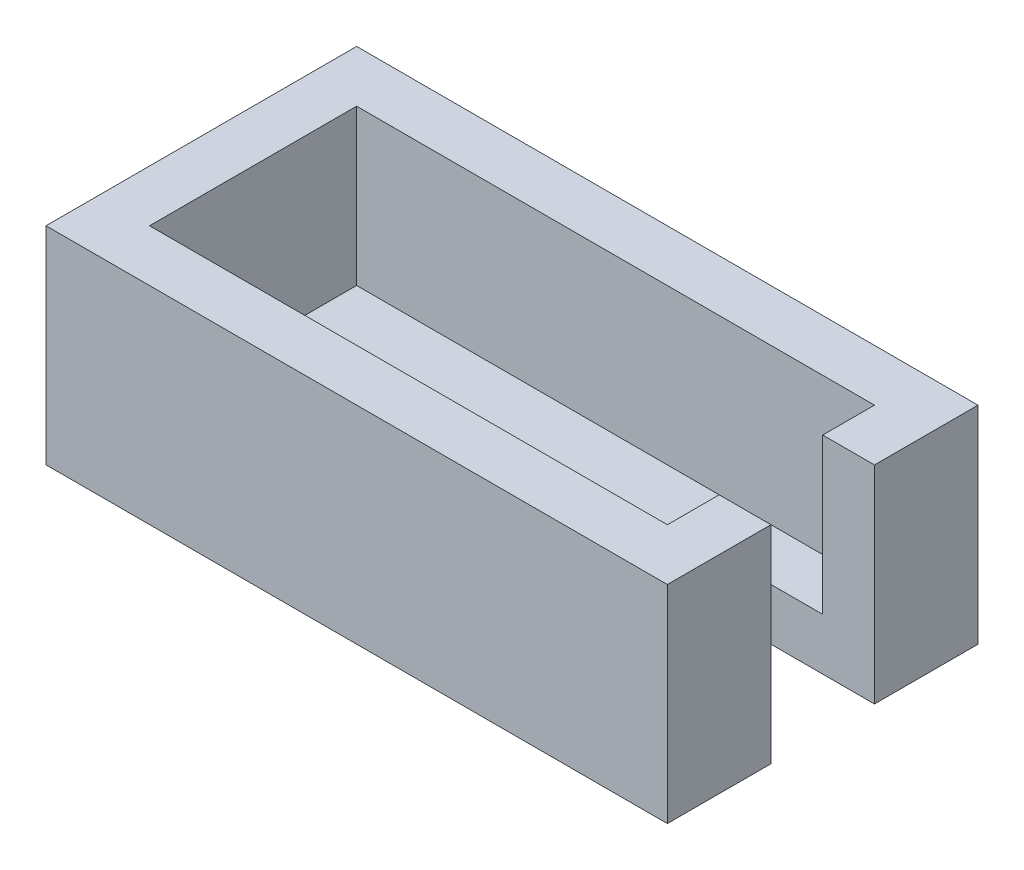
ISO-10303-21;
HEADER;
FILE_DESCRIPTION(('STEP AP214'),'2;1');
FILE_NAME('part.step','',(''),(''),'','','');
FILE_SCHEMA(('AUTOMOTIVE_DESIGN { 1 0 10303 214 1 1 1 1 }'));
ENDSEC;
DATA;
#1=APPLICATION_CONTEXT('core data for automotive mechanical design processes');
#2=APPLICATION_PROTOCOL_DEFINITION('international standard','automotive_design',2000,#1);
#3=PRODUCT_CONTEXT('',#1,'mechanical');
#4=PRODUCT('Part','Part','',(#3));
#5=PRODUCT_RELATED_PRODUCT_CATEGORY('part','',(#4));
#6=PRODUCT_DEFINITION_FORMATION('','',#4);
#7=PRODUCT_DEFINITION_CONTEXT('part definition',#1,'design');
#8=PRODUCT_DEFINITION('design','',#6,#7);
#9=PRODUCT_DEFINITION_SHAPE('','',#8);
#10=(LENGTH_UNIT() NAMED_UNIT(*) SI_UNIT(.MILLI.,.METRE.));
#11=(NAMED_UNIT(*) PLANE_ANGLE_UNIT() SI_UNIT($,.RADIAN.));
#12=(NAMED_UNIT(*) SI_UNIT($,.STERADIAN.) SOLID_ANGLE_UNIT());
#13=UNCERTAINTY_MEASURE_WITH_UNIT(LENGTH_MEASURE(1.E-05),#10,'distance_accuracy_value','');
#14=(GEOMETRIC_REPRESENTATION_CONTEXT(3) GLOBAL_UNCERTAINTY_ASSIGNED_CONTEXT((#13)) GLOBAL_UNIT_ASSIGNED_CONTEXT((#10,
#11,#12)) REPRESENTATION_CONTEXT('',''));
#15=CARTESIAN_POINT('',(0.,0.,0.));
#16=DIRECTION('',(0.,0.,1.));
#17=DIRECTION('',(1.,0.,0.));
#18=AXIS2_PLACEMENT_3D('',#15,#16,#17);
#19=CARTESIAN_POINT('',(241.39873634665,147.32,0.));
#20=DIRECTION('',(-1.,0.,0.));
#21=DIRECTION('',(0.,0.,1.));
#22=AXIS2_PLACEMENT_3D('',#19,#20,#21);
#23=PLANE('',#22);
#24=DIRECTION('',(0.,0.,-1.));
#25=VECTOR('',#24,1.);
#26=CARTESIAN_POINT('',(241.39873634665,25.4,0.));
#27=LINE('',#26,#25);
#28=CARTESIAN_POINT('',(241.39873634665,25.4,-50.82609306188));
#29=VERTEX_POINT('',#28);
#30=CARTESIAN_POINT('',(241.39873634665,25.4,-101.62609306188));
#31=VERTEX_POINT('',#30);
#32=EDGE_CURVE('E174',#29,#31,#27,.T.);
#33=ORIENTED_EDGE('',*,*,#32,.F.);
#34=DIRECTION('',(0.,-1.,0.));
#35=VECTOR('',#34,1.);
#36=CARTESIAN_POINT('',(241.39873634665,147.32,-50.82609306188));
#37=LINE('',#36,#35);
#38=CARTESIAN_POINT('',(241.39873634665,0.,-50.82609306188));
#39=VERTEX_POINT('',#38);
#40=EDGE_CURVE('E196',#29,#39,#37,.T.);
#41=ORIENTED_EDGE('',*,*,#40,.T.);
#42=DIRECTION('',(0.,0.,-1.));
#43=VECTOR('',#42,1.);
#44=CARTESIAN_POINT('',(241.39873634665,0.,0.));
#45=LINE('',#44,#43);
#46=CARTESIAN_POINT('',(241.39873634665,0.,-101.62609306188));
#47=VERTEX_POINT('',#46);
#48=EDGE_CURVE('E187',#39,#47,#45,.T.);
#49=ORIENTED_EDGE('',*,*,#48,.T.);
#50=DIRECTION('',(0.,-1.,0.));
#51=VECTOR('',#50,1.);
#52=CARTESIAN_POINT('',(241.39873634665,147.32,-101.62609306188));
#53=LINE('',#52,#51);
#54=EDGE_CURVE('E198',#31,#47,#53,.T.);
#55=ORIENTED_EDGE('',*,*,#54,.F.);
#56=EDGE_LOOP('',(#33,#41,#49,#55));
#57=FACE_BOUND('',#56,.T.);
#58=ADVANCED_FACE('F33',(#57),#23,.F.);
#59=CARTESIAN_POINT('',(304.89873634665,101.6,0.));
#60=DIRECTION('',(-1.,0.,0.));
#61=DIRECTION('',(0.,0.,1.));
#62=AXIS2_PLACEMENT_3D('',#59,#60,#61);
#63=PLANE('',#62);
#64=DIRECTION('',(0.,0.,-1.));
#65=VECTOR('',#64,1.);
#66=CARTESIAN_POINT('',(304.89873634665,101.6,0.));
#67=LINE('',#66,#65);
#68=CARTESIAN_POINT('',(304.89873634665,101.6,-101.62609306188));
#69=VERTEX_POINT('',#68);
#70=CARTESIAN_POINT('',(304.89873634665,101.6,-152.42609306188));
#71=VERTEX_POINT('',#70);
#72=EDGE_CURVE('E210',#69,#71,#67,.T.);
#73=ORIENTED_EDGE('',*,*,#72,.F.);
#74=DIRECTION('',(0.,-1.,0.));
#75=VECTOR('',#74,1.);
#76=CARTESIAN_POINT('',(304.89873634665,147.32,-101.62609306188));
#77=LINE('',#76,#75);
#78=CARTESIAN_POINT('',(304.89873634665,0.,-101.62609306188));
#79=VERTEX_POINT('',#78);
#80=EDGE_CURVE('E192',#69,#79,#77,.T.);
#81=ORIENTED_EDGE('',*,*,#80,.T.);
#82=DIRECTION('',(0.,0.,-1.));
#83=VECTOR('',#82,1.);
#84=CARTESIAN_POINT('',(304.89873634665,0.,0.));
#85=LINE('',#84,#83);
#86=CARTESIAN_POINT('',(304.89873634665,0.,-152.42609306188));
#87=VERTEX_POINT('',#86);
#88=EDGE_CURVE('E205',#79,#87,#85,.T.);
#89=ORIENTED_EDGE('',*,*,#88,.T.);
#90=DIRECTION('',(0.,-1.,0.));
#91=VECTOR('',#90,1.);
#92=CARTESIAN_POINT('',(304.89873634665,101.6,-152.42609306188));
#93=LINE('',#92,#91);
#94=EDGE_CURVE('E236',#71,#87,#93,.T.);
#95=ORIENTED_EDGE('',*,*,#94,.F.);
#96=EDGE_LOOP('',(#73,#81,#89,#95));
#97=FACE_BOUND('',#96,.T.);
#98=ADVANCED_FACE('F257',(#97),#63,.F.);
#99=CARTESIAN_POINT('',(304.89873634665,0.,0.));
#100=VERTEX_POINT('',#99);
#101=CARTESIAN_POINT('',(304.89873634665,0.,-50.82609306188));
#102=VERTEX_POINT('',#101);
#103=EDGE_CURVE('E219',#100,#102,#85,.T.);
#104=ORIENTED_EDGE('',*,*,#103,.T.);
#105=DIRECTION('',(0.,-1.,0.));
#106=VECTOR('',#105,1.);
#107=CARTESIAN_POINT('',(304.89873634665,147.32,-50.82609306188));
#108=LINE('',#107,#106);
#109=CARTESIAN_POINT('',(304.89873634665,101.6,-50.82609306188));
#110=VERTEX_POINT('',#109);
#111=EDGE_CURVE('E56',#110,#102,#108,.T.);
#112=ORIENTED_EDGE('',*,*,#111,.F.);
#113=CARTESIAN_POINT('',(304.89873634665,101.6,0.));
#114=VERTEX_POINT('',#113);
#115=EDGE_CURVE('E206',#114,#110,#67,.T.);
#116=ORIENTED_EDGE('',*,*,#115,.F.);
#117=DIRECTION('',(0.,-1.,0.));
#118=VECTOR('',#117,1.);
#119=CARTESIAN_POINT('',(304.89873634665,101.6,0.));
#120=LINE('',#119,#118);
#121=EDGE_CURVE('E218',#114,#100,#120,.T.);
#122=ORIENTED_EDGE('',*,*,#121,.T.);
#123=EDGE_LOOP('',(#104,#112,#116,#122));
#124=FACE_BOUND('',#123,.T.);
#125=ADVANCED_FACE('F35',(#124),#63,.F.);
#126=CARTESIAN_POINT('',(0.,101.6,-152.42609306188));
#127=DIRECTION('',(0.,0.,-1.));
#128=DIRECTION('',(-1.,0.,0.));
#129=AXIS2_PLACEMENT_3D('',#126,#127,#128);
#130=PLANE('',#129);
#131=DIRECTION('',(1.,0.,0.));
#132=VECTOR('',#131,1.);
#133=CARTESIAN_POINT('',(0.,0.,-152.42609306188));
#134=LINE('',#133,#132);
#135=CARTESIAN_POINT('',(0.,0.,-152.42609306188));
#136=VERTEX_POINT('',#135);
#137=EDGE_CURVE('E222',#136,#87,#134,.T.);
#138=ORIENTED_EDGE('',*,*,#137,.F.);
#139=DIRECTION('',(0.,-1.,0.));
#140=VECTOR('',#139,1.);
#141=CARTESIAN_POINT('',(0.,101.6,-152.42609306188));
#142=LINE('',#141,#140);
#143=CARTESIAN_POINT('',(0.,101.6,-152.42609306188));
#144=VERTEX_POINT('',#143);
#145=EDGE_CURVE('E234',#144,#136,#142,.T.);
#146=ORIENTED_EDGE('',*,*,#145,.F.);
#147=DIRECTION('',(1.,0.,0.));
#148=VECTOR('',#147,1.);
#149=CARTESIAN_POINT('',(0.,101.6,-152.42609306188));
#150=LINE('',#149,#148);
#151=EDGE_CURVE('E209',#144,#71,#150,.T.);
#152=ORIENTED_EDGE('',*,*,#151,.T.);
#153=ORIENTED_EDGE('',*,*,#94,.T.);
#154=EDGE_LOOP('',(#138,#146,#152,#153));
#155=FACE_BOUND('',#154,.T.);
#156=ADVANCED_FACE('F286',(#155),#130,.T.);
#157=CARTESIAN_POINT('',(0.,101.6,0.));
#158=DIRECTION('',(-1.,0.,0.));
#159=DIRECTION('',(0.,0.,1.));
#160=AXIS2_PLACEMENT_3D('',#157,#158,#159);
#161=PLANE('',#160);
#162=DIRECTION('',(0.,0.,-1.));
#163=VECTOR('',#162,1.);
#164=CARTESIAN_POINT('',(0.,0.,0.));
#165=LINE('',#164,#163);
#166=CARTESIAN_POINT('',(0.,0.,0.));
#167=VERTEX_POINT('',#166);
#168=EDGE_CURVE('E225',#167,#136,#165,.T.);
#169=ORIENTED_EDGE('',*,*,#168,.F.);
#170=DIRECTION('',(0.,-1.,0.));
#171=VECTOR('',#170,1.);
#172=CARTESIAN_POINT('',(0.,101.6,0.));
#173=LINE('',#172,#171);
#174=CARTESIAN_POINT('',(0.,101.6,0.));
#175=VERTEX_POINT('',#174);
#176=EDGE_CURVE('E232',#175,#167,#173,.T.);
#177=ORIENTED_EDGE('',*,*,#176,.F.);
#178=DIRECTION('',(0.,0.,-1.));
#179=VECTOR('',#178,1.);
#180=CARTESIAN_POINT('',(0.,101.6,0.));
#181=LINE('',#180,#179);
#182=EDGE_CURVE('E213',#175,#144,#181,.T.);
#183=ORIENTED_EDGE('',*,*,#182,.T.);
#184=ORIENTED_EDGE('',*,*,#145,.T.);
#185=EDGE_LOOP('',(#169,#177,#183,#184));
#186=FACE_BOUND('',#185,.T.);
#187=ADVANCED_FACE('F283',(#186),#161,.T.);
#188=CARTESIAN_POINT('',(0.,101.6,0.));
#189=DIRECTION('',(0.,0.,-1.));
#190=DIRECTION('',(-1.,0.,0.));
#191=AXIS2_PLACEMENT_3D('',#188,#189,#190);
#192=PLANE('',#191);
#193=DIRECTION('',(1.,0.,0.));
#194=VECTOR('',#193,1.);
#195=CARTESIAN_POINT('',(0.,0.,0.));
#196=LINE('',#195,#194);
#197=EDGE_CURVE('E228',#167,#100,#196,.T.);
#198=ORIENTED_EDGE('',*,*,#197,.T.);
#199=ORIENTED_EDGE('',*,*,#121,.F.);
#200=DIRECTION('',(1.,0.,0.));
#201=VECTOR('',#200,1.);
#202=CARTESIAN_POINT('',(0.,101.6,0.));
#203=LINE('',#202,#201);
#204=EDGE_CURVE('E216',#175,#114,#203,.T.);
#205=ORIENTED_EDGE('',*,*,#204,.F.);
#206=ORIENTED_EDGE('',*,*,#176,.T.);
#207=EDGE_LOOP('',(#198,#199,#205,#206));
#208=FACE_BOUND('',#207,.T.);
#209=ADVANCED_FACE('F279',(#208),#192,.F.);
#210=CARTESIAN_POINT('',(0.,101.6,0.));
#211=DIRECTION('',(0.,-1.,0.));
#212=DIRECTION('',(0.,0.,-1.));
#213=AXIS2_PLACEMENT_3D('',#210,#211,#212);
#214=PLANE('',#213);
#215=DIRECTION('',(-1.,0.,0.));
#216=VECTOR('',#215,1.);
#217=CARTESIAN_POINT('',(25.4,101.6,-127.02609306188));
#218=LINE('',#217,#216);
#219=CARTESIAN_POINT('',(279.49873634665,101.6,-127.02609306188));
#220=VERTEX_POINT('',#219);
#221=CARTESIAN_POINT('',(25.4,101.6,-127.02609306188));
#222=VERTEX_POINT('',#221);
#223=EDGE_CURVE('E156',#220,#222,#218,.T.);
#224=ORIENTED_EDGE('',*,*,#223,.F.);
#225=DIRECTION('',(0.,0.,-1.));
#226=VECTOR('',#225,1.);
#227=CARTESIAN_POINT('',(279.49873634665,101.6,-127.02609306188));
#228=LINE('',#227,#226);
#229=CARTESIAN_POINT('',(279.49873634665,101.6,-101.62609306188));
#230=VERTEX_POINT('',#229);
#231=EDGE_CURVE('E170',#230,#220,#228,.T.);
#232=ORIENTED_EDGE('',*,*,#231,.F.);
#233=DIRECTION('',(1.,0.,0.));
#234=VECTOR('',#233,1.);
#235=CARTESIAN_POINT('',(0.,101.6,-101.62609306188));
#236=LINE('',#235,#234);
#237=EDGE_CURVE('E203',#230,#69,#236,.T.);
#238=ORIENTED_EDGE('',*,*,#237,.T.);
#239=ORIENTED_EDGE('',*,*,#72,.T.);
#240=ORIENTED_EDGE('',*,*,#151,.F.);
#241=ORIENTED_EDGE('',*,*,#182,.F.);
#242=ORIENTED_EDGE('',*,*,#204,.T.);
#243=ORIENTED_EDGE('',*,*,#115,.T.);
#244=DIRECTION('',(-1.,0.,0.));
#245=VECTOR('',#244,1.);
#246=CARTESIAN_POINT('',(0.,101.6,-50.82609306188));
#247=LINE('',#246,#245);
#248=CARTESIAN_POINT('',(279.49873634665,101.6,-50.82609306188));
#249=VERTEX_POINT('',#248);
#250=EDGE_CURVE('E200',#110,#249,#247,.T.);
#251=ORIENTED_EDGE('',*,*,#250,.T.);
#252=CARTESIAN_POINT('',(279.49873634665,101.6,-25.4));
#253=VERTEX_POINT('',#252);
#254=EDGE_CURVE('E159',#253,#249,#228,.T.);
#255=ORIENTED_EDGE('',*,*,#254,.F.);
#256=DIRECTION('',(1.,0.,0.));
#257=VECTOR('',#256,1.);
#258=CARTESIAN_POINT('',(25.4,101.6,-25.4));
#259=LINE('',#258,#257);
#260=CARTESIAN_POINT('',(25.4,101.6,-25.4));
#261=VERTEX_POINT('',#260);
#262=EDGE_CURVE('E168',#261,#253,#259,.T.);
#263=ORIENTED_EDGE('',*,*,#262,.F.);
#264=DIRECTION('',(0.,0.,1.));
#265=VECTOR('',#264,1.);
#266=CARTESIAN_POINT('',(25.4,101.6,-127.02609306188));
#267=LINE('',#266,#265);
#268=EDGE_CURVE('E143',#222,#261,#267,.T.);
#269=ORIENTED_EDGE('',*,*,#268,.F.);
#270=EDGE_LOOP('',(#224,#232,#238,#239,#240,#241,#242,#243,#251,#255,#263,#269));
#271=FACE_BOUND('',#270,.T.);
#272=ADVANCED_FACE('F262',(#271),#214,.F.);
#273=CARTESIAN_POINT('',(0.,0.,0.));
#274=DIRECTION('',(0.,-1.,0.));
#275=DIRECTION('',(0.,0.,-1.));
#276=AXIS2_PLACEMENT_3D('',#273,#274,#275);
#277=PLANE('',#276);
#278=CARTESIAN_POINT('',(76.2,0.,-76.2260930618801));
#279=DIRECTION('',(0.,1.,0.));
#280=DIRECTION('',(0.,0.,1.));
#281=AXIS2_PLACEMENT_3D('',#278,#279,#280);
#282=CIRCLE('',#281,19.05);
#283=CARTESIAN_POINT('',(76.2,0.,-57.1760930618801));
#284=VERTEX_POINT('',#283);
#285=EDGE_CURVE('E449',#284,#284,#282,.T.);
#286=ORIENTED_EDGE('',*,*,#285,.T.);
#287=EDGE_LOOP('',(#286));
#288=FACE_BOUND('',#287,.T.);
#289=CARTESIAN_POINT('',(133.35,0.,-76.2260930618801));
#290=DIRECTION('',(0.,1.,0.));
#291=DIRECTION('',(0.,0.,1.));
#292=AXIS2_PLACEMENT_3D('',#289,#290,#291);
#293=CIRCLE('',#292,19.05);
#294=CARTESIAN_POINT('',(133.35,0.,-57.17609306188));
#295=VERTEX_POINT('',#294);
#296=EDGE_CURVE('E450',#295,#295,#293,.T.);
#297=ORIENTED_EDGE('',*,*,#296,.T.);
#298=EDGE_LOOP('',(#297));
#299=FACE_BOUND('',#298,.T.);
#300=CARTESIAN_POINT('',(190.5,0.,-76.2260930618801));
#301=DIRECTION('',(0.,1.,0.));
#302=DIRECTION('',(0.,0.,1.));
#303=AXIS2_PLACEMENT_3D('',#300,#301,#302);
#304=CIRCLE('',#303,19.05);
#305=CARTESIAN_POINT('',(190.5,0.,-57.1760930618801));
#306=VERTEX_POINT('',#305);
#307=EDGE_CURVE('E455',#306,#306,#304,.T.);
#308=ORIENTED_EDGE('',*,*,#307,.T.);
#309=EDGE_LOOP('',(#308));
#310=FACE_BOUND('',#309,.T.);
#311=DIRECTION('',(1.,0.,0.));
#312=VECTOR('',#311,1.);
#313=CARTESIAN_POINT('',(0.,0.,-101.62609306188));
#314=LINE('',#313,#312);
#315=EDGE_CURVE('E185',#47,#79,#314,.T.);
#316=ORIENTED_EDGE('',*,*,#315,.F.);
#317=ORIENTED_EDGE('',*,*,#48,.F.);
#318=DIRECTION('',(-1.,0.,0.));
#319=VECTOR('',#318,1.);
#320=CARTESIAN_POINT('',(0.,0.,-50.82609306188));
#321=LINE('',#320,#319);
#322=EDGE_CURVE('E190',#102,#39,#321,.T.);
#323=ORIENTED_EDGE('',*,*,#322,.F.);
#324=ORIENTED_EDGE('',*,*,#103,.F.);
#325=ORIENTED_EDGE('',*,*,#197,.F.);
#326=ORIENTED_EDGE('',*,*,#168,.T.);
#327=ORIENTED_EDGE('',*,*,#137,.T.);
#328=ORIENTED_EDGE('',*,*,#88,.F.);
#329=EDGE_LOOP('',(#316,#317,#323,#324,#325,#326,#327,#328));
#330=FACE_BOUND('',#329,.T.);
#331=ADVANCED_FACE('F249',(#288,#299,#310,#330),#277,.T.);
#332=CARTESIAN_POINT('',(0.,147.32,-101.62609306188));
#333=DIRECTION('',(0.,0.,-1.));
#334=DIRECTION('',(-1.,0.,0.));
#335=AXIS2_PLACEMENT_3D('',#332,#333,#334);
#336=PLANE('',#335);
#337=ORIENTED_EDGE('',*,*,#237,.F.);
#338=DIRECTION('',(0.,-1.,0.));
#339=VECTOR('',#338,1.);
#340=CARTESIAN_POINT('',(279.49873634665,147.32,-101.62609306188));
#341=LINE('',#340,#339);
#342=CARTESIAN_POINT('',(279.49873634665,25.4,-101.62609306188));
#343=VERTEX_POINT('',#342);
#344=EDGE_CURVE('E182',#230,#343,#341,.T.);
#345=ORIENTED_EDGE('',*,*,#344,.T.);
#346=DIRECTION('',(1.,0.,0.));
#347=VECTOR('',#346,1.);
#348=CARTESIAN_POINT('',(0.,25.4,-101.62609306188));
#349=LINE('',#348,#347);
#350=EDGE_CURVE('E180',#31,#343,#349,.T.);
#351=ORIENTED_EDGE('',*,*,#350,.F.);
#352=ORIENTED_EDGE('',*,*,#54,.T.);
#353=ORIENTED_EDGE('',*,*,#315,.T.);
#354=ORIENTED_EDGE('',*,*,#80,.F.);
#355=EDGE_LOOP('',(#337,#345,#351,#352,#353,#354));
#356=FACE_BOUND('',#355,.T.);
#357=ADVANCED_FACE('F254',(#356),#336,.F.);
#358=CARTESIAN_POINT('',(0.,147.32,-50.82609306188));
#359=DIRECTION('',(0.,0.,1.));
#360=DIRECTION('',(1.,0.,0.));
#361=AXIS2_PLACEMENT_3D('',#358,#359,#360);
#362=PLANE('',#361);
#363=DIRECTION('',(-1.,0.,0.));
#364=VECTOR('',#363,1.);
#365=CARTESIAN_POINT('',(0.,25.4,-50.82609306188));
#366=LINE('',#365,#364);
#367=CARTESIAN_POINT('',(279.49873634665,25.4,-50.82609306188));
#368=VERTEX_POINT('',#367);
#369=EDGE_CURVE('E41',#368,#29,#366,.T.);
#370=ORIENTED_EDGE('',*,*,#369,.F.);
#371=DIRECTION('',(0.,1.,0.));
#372=VECTOR('',#371,1.);
#373=CARTESIAN_POINT('',(279.49873634665,147.32,-50.82609306188));
#374=LINE('',#373,#372);
#375=EDGE_CURVE('E11',#368,#249,#374,.T.);
#376=ORIENTED_EDGE('',*,*,#375,.T.);
#377=ORIENTED_EDGE('',*,*,#250,.F.);
#378=ORIENTED_EDGE('',*,*,#111,.T.);
#379=ORIENTED_EDGE('',*,*,#322,.T.);
#380=ORIENTED_EDGE('',*,*,#40,.F.);
#381=EDGE_LOOP('',(#370,#376,#377,#378,#379,#380));
#382=FACE_BOUND('',#381,.T.);
#383=ADVANCED_FACE('F244',(#382),#362,.F.);
#384=CARTESIAN_POINT('',(279.49873634665,25.4,-127.02609306188));
#385=DIRECTION('',(1.,0.,0.));
#386=DIRECTION('',(0.,0.,-1.));
#387=AXIS2_PLACEMENT_3D('',#384,#385,#386);
#388=PLANE('',#387);
#389=ORIENTED_EDGE('',*,*,#231,.T.);
#390=DIRECTION('',(0.,1.,0.));
#391=VECTOR('',#390,1.);
#392=CARTESIAN_POINT('',(279.49873634665,25.4,-127.02609306188));
#393=LINE('',#392,#391);
#394=CARTESIAN_POINT('',(279.49873634665,25.4,-127.02609306188));
#395=VERTEX_POINT('',#394);
#396=EDGE_CURVE('E175',#395,#220,#393,.T.);
#397=ORIENTED_EDGE('',*,*,#396,.F.);
#398=DIRECTION('',(0.,0.,-1.));
#399=VECTOR('',#398,1.);
#400=CARTESIAN_POINT('',(279.49873634665,25.4,-127.02609306188));
#401=LINE('',#400,#399);
#402=EDGE_CURVE('E152',#343,#395,#401,.T.);
#403=ORIENTED_EDGE('',*,*,#402,.F.);
#404=ORIENTED_EDGE('',*,*,#344,.F.);
#405=EDGE_LOOP('',(#389,#397,#403,#404));
#406=FACE_BOUND('',#405,.T.);
#407=ADVANCED_FACE('F267',(#406),#388,.F.);
#408=CARTESIAN_POINT('',(279.49873634665,25.4,-25.4));
#409=VERTEX_POINT('',#408);
#410=EDGE_CURVE('E48',#409,#368,#401,.T.);
#411=ORIENTED_EDGE('',*,*,#410,.F.);
#412=DIRECTION('',(0.,1.,0.));
#413=VECTOR('',#412,1.);
#414=CARTESIAN_POINT('',(279.49873634665,25.4,-25.4));
#415=LINE('',#414,#413);
#416=EDGE_CURVE('E147',#409,#253,#415,.T.);
#417=ORIENTED_EDGE('',*,*,#416,.T.);
#418=ORIENTED_EDGE('',*,*,#254,.T.);
#419=ORIENTED_EDGE('',*,*,#375,.F.);
#420=EDGE_LOOP('',(#411,#417,#418,#419));
#421=FACE_BOUND('',#420,.T.);
#422=ADVANCED_FACE('F273',(#421),#388,.F.);
#423=CARTESIAN_POINT('',(0.,25.4,0.));
#424=DIRECTION('',(0.,1.,0.));
#425=DIRECTION('',(0.,0.,1.));
#426=AXIS2_PLACEMENT_3D('',#423,#424,#425);
#427=PLANE('',#426);
#428=CARTESIAN_POINT('',(76.2,25.4,-76.2260930618801));
#429=DIRECTION('',(0.,1.,0.));
#430=DIRECTION('',(0.,0.,1.));
#431=AXIS2_PLACEMENT_3D('',#428,#429,#430);
#432=CIRCLE('',#431,19.05);
#433=CARTESIAN_POINT('',(76.2,25.4,-57.1760930618801));
#434=VERTEX_POINT('',#433);
#435=EDGE_CURVE('E446',#434,#434,#432,.F.);
#436=ORIENTED_EDGE('',*,*,#435,.T.);
#437=EDGE_LOOP('',(#436));
#438=FACE_BOUND('',#437,.T.);
#439=CARTESIAN_POINT('',(133.35,25.4,-76.2260930618801));
#440=DIRECTION('',(0.,1.,0.));
#441=DIRECTION('',(0.,0.,1.));
#442=AXIS2_PLACEMENT_3D('',#439,#440,#441);
#443=CIRCLE('',#442,19.05);
#444=CARTESIAN_POINT('',(133.35,25.4,-57.17609306188));
#445=VERTEX_POINT('',#444);
#446=EDGE_CURVE('E452',#445,#445,#443,.F.);
#447=ORIENTED_EDGE('',*,*,#446,.T.);
#448=EDGE_LOOP('',(#447));
#449=FACE_BOUND('',#448,.T.);
#450=CARTESIAN_POINT('',(190.5,25.4,-76.2260930618801));
#451=DIRECTION('',(0.,1.,0.));
#452=DIRECTION('',(0.,0.,1.));
#453=AXIS2_PLACEMENT_3D('',#450,#451,#452);
#454=CIRCLE('',#453,19.05);
#455=CARTESIAN_POINT('',(190.5,25.4,-57.1760930618801));
#456=VERTEX_POINT('',#455);
#457=EDGE_CURVE('E162',#456,#456,#454,.F.);
#458=ORIENTED_EDGE('',*,*,#457,.T.);
#459=EDGE_LOOP('',(#458));
#460=FACE_BOUND('',#459,.T.);
#461=ORIENTED_EDGE('',*,*,#350,.T.);
#462=ORIENTED_EDGE('',*,*,#402,.T.);
#463=DIRECTION('',(-1.,0.,0.));
#464=VECTOR('',#463,1.);
#465=CARTESIAN_POINT('',(25.4,25.4,-127.02609306188));
#466=LINE('',#465,#464);
#467=CARTESIAN_POINT('',(25.4,25.4,-127.02609306188));
#468=VERTEX_POINT('',#467);
#469=EDGE_CURVE('E148',#395,#468,#466,.T.);
#470=ORIENTED_EDGE('',*,*,#469,.T.);
#471=DIRECTION('',(0.,0.,1.));
#472=VECTOR('',#471,1.);
#473=CARTESIAN_POINT('',(25.4,25.4,-127.02609306188));
#474=LINE('',#473,#472);
#475=CARTESIAN_POINT('',(25.4,25.4,-25.4));
#476=VERTEX_POINT('',#475);
#477=EDGE_CURVE('E140',#468,#476,#474,.T.);
#478=ORIENTED_EDGE('',*,*,#477,.T.);
#479=DIRECTION('',(1.,0.,0.));
#480=VECTOR('',#479,1.);
#481=CARTESIAN_POINT('',(25.4,25.4,-25.4));
#482=LINE('',#481,#480);
#483=EDGE_CURVE('E150',#476,#409,#482,.T.);
#484=ORIENTED_EDGE('',*,*,#483,.T.);
#485=ORIENTED_EDGE('',*,*,#410,.T.);
#486=ORIENTED_EDGE('',*,*,#369,.T.);
#487=ORIENTED_EDGE('',*,*,#32,.T.);
#488=EDGE_LOOP('',(#461,#462,#470,#478,#484,#485,#486,#487));
#489=FACE_BOUND('',#488,.T.);
#490=ADVANCED_FACE('F154',(#438,#449,#460,#489),#427,.T.);
#491=CARTESIAN_POINT('',(25.4,25.4,-127.02609306188));
#492=DIRECTION('',(-1.,0.,0.));
#493=DIRECTION('',(0.,0.,1.));
#494=AXIS2_PLACEMENT_3D('',#491,#492,#493);
#495=PLANE('',#494);
#496=ORIENTED_EDGE('',*,*,#268,.T.);
#497=DIRECTION('',(0.,1.,0.));
#498=VECTOR('',#497,1.);
#499=CARTESIAN_POINT('',(25.4,25.4,-25.4));
#500=LINE('',#499,#498);
#501=EDGE_CURVE('E136',#476,#261,#500,.T.);
#502=ORIENTED_EDGE('',*,*,#501,.F.);
#503=ORIENTED_EDGE('',*,*,#477,.F.);
#504=DIRECTION('',(0.,1.,0.));
#505=VECTOR('',#504,1.);
#506=CARTESIAN_POINT('',(25.4,25.4,-127.02609306188));
#507=LINE('',#506,#505);
#508=EDGE_CURVE('E172',#468,#222,#507,.T.);
#509=ORIENTED_EDGE('',*,*,#508,.T.);
#510=EDGE_LOOP('',(#496,#502,#503,#509));
#511=FACE_BOUND('',#510,.T.);
#512=ADVANCED_FACE('F138',(#511),#495,.F.);
#513=CARTESIAN_POINT('',(25.4,25.4,-127.02609306188));
#514=DIRECTION('',(0.,0.,-1.));
#515=DIRECTION('',(-1.,0.,0.));
#516=AXIS2_PLACEMENT_3D('',#513,#514,#515);
#517=PLANE('',#516);
#518=ORIENTED_EDGE('',*,*,#223,.T.);
#519=ORIENTED_EDGE('',*,*,#508,.F.);
#520=ORIENTED_EDGE('',*,*,#469,.F.);
#521=ORIENTED_EDGE('',*,*,#396,.T.);
#522=EDGE_LOOP('',(#518,#519,#520,#521));
#523=FACE_BOUND('',#522,.T.);
#524=ADVANCED_FACE('F270',(#523),#517,.F.);
#525=CARTESIAN_POINT('',(25.4,25.4,-25.4));
#526=DIRECTION('',(0.,0.,1.));
#527=DIRECTION('',(1.,0.,0.));
#528=AXIS2_PLACEMENT_3D('',#525,#526,#527);
#529=PLANE('',#528);
#530=ORIENTED_EDGE('',*,*,#262,.T.);
#531=ORIENTED_EDGE('',*,*,#416,.F.);
#532=ORIENTED_EDGE('',*,*,#483,.F.);
#533=ORIENTED_EDGE('',*,*,#501,.T.);
#534=EDGE_LOOP('',(#530,#531,#532,#533));
#535=FACE_BOUND('',#534,.T.);
#536=ADVANCED_FACE('F151',(#535),#529,.F.);
#537=CARTESIAN_POINT('',(190.5,138.938,-76.2260930618801));
#538=DIRECTION('',(0.,-1.,0.));
#539=DIRECTION('',(0.,0.,-1.));
#540=AXIS2_PLACEMENT_3D('',#537,#538,#539);
#541=CYLINDRICAL_SURFACE('',#540,19.05);
#542=ORIENTED_EDGE('',*,*,#457,.F.);
#543=EDGE_LOOP('',(#542));
#544=FACE_BOUND('',#543,.T.);
#545=ORIENTED_EDGE('',*,*,#307,.F.);
#546=EDGE_LOOP('',(#545));
#547=FACE_BOUND('',#546,.T.);
#548=ADVANCED_FACE('F367',(#544,#547),#541,.F.);
#549=CARTESIAN_POINT('',(133.35,138.938,-76.2260930618801));
#550=DIRECTION('',(0.,-1.,0.));
#551=DIRECTION('',(0.,0.,-1.));
#552=AXIS2_PLACEMENT_3D('',#549,#550,#551);
#553=CYLINDRICAL_SURFACE('',#552,19.05);
#554=ORIENTED_EDGE('',*,*,#446,.F.);
#555=EDGE_LOOP('',(#554));
#556=FACE_BOUND('',#555,.T.);
#557=ORIENTED_EDGE('',*,*,#296,.F.);
#558=EDGE_LOOP('',(#557));
#559=FACE_BOUND('',#558,.T.);
#560=ADVANCED_FACE('F373',(#556,#559),#553,.F.);
#561=CARTESIAN_POINT('',(76.2,138.938,-76.2260930618801));
#562=DIRECTION('',(0.,-1.,0.));
#563=DIRECTION('',(0.,0.,-1.));
#564=AXIS2_PLACEMENT_3D('',#561,#562,#563);
#565=CYLINDRICAL_SURFACE('',#564,19.05);
#566=ORIENTED_EDGE('',*,*,#435,.F.);
#567=EDGE_LOOP('',(#566));
#568=FACE_BOUND('',#567,.T.);
#569=ORIENTED_EDGE('',*,*,#285,.F.);
#570=EDGE_LOOP('',(#569));
#571=FACE_BOUND('',#570,.T.);
#572=ADVANCED_FACE('F381',(#568,#571),#565,.F.);
#573=CLOSED_SHELL('',(#58,#98,#125,#156,#187,#209,#272,#331,#357,#383,#407,#422,#490,#512,#524,
#536,#548,#560,#572));
#574=MANIFOLD_SOLID_BREP('B2',#573);
#575=ADVANCED_BREP_SHAPE_REPRESENTATION('',(#18,#574),#14);
#576=SHAPE_DEFINITION_REPRESENTATION(#9,#575);
ENDSEC;
END-ISO-10303-21;
